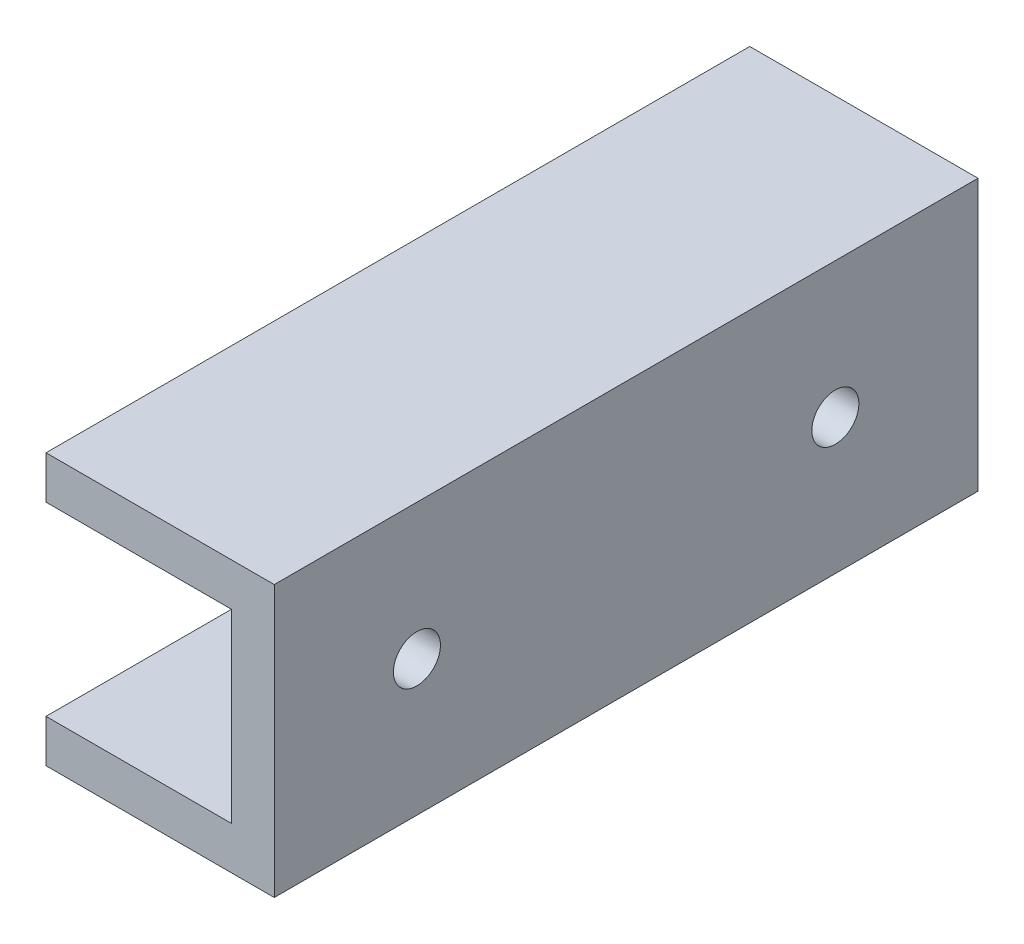
ISO-10303-21;
HEADER;
FILE_DESCRIPTION(('STEP AP214'),'2;1');
FILE_NAME('part.step','',(''),(''),'','','');
FILE_SCHEMA(('AUTOMOTIVE_DESIGN { 1 0 10303 214 1 1 1 1 }'));
ENDSEC;
DATA;
#1=APPLICATION_CONTEXT('core data for automotive mechanical design processes');
#2=APPLICATION_PROTOCOL_DEFINITION('international standard','automotive_design',2000,#1);
#3=PRODUCT_CONTEXT('',#1,'mechanical');
#4=PRODUCT('Part','Part','',(#3));
#5=PRODUCT_RELATED_PRODUCT_CATEGORY('part','',(#4));
#6=PRODUCT_DEFINITION_FORMATION('','',#4);
#7=PRODUCT_DEFINITION_CONTEXT('part definition',#1,'design');
#8=PRODUCT_DEFINITION('design','',#6,#7);
#9=PRODUCT_DEFINITION_SHAPE('','',#8);
#10=(LENGTH_UNIT() NAMED_UNIT(*) SI_UNIT(.MILLI.,.METRE.));
#11=(NAMED_UNIT(*) PLANE_ANGLE_UNIT() SI_UNIT($,.RADIAN.));
#12=(NAMED_UNIT(*) SI_UNIT($,.STERADIAN.) SOLID_ANGLE_UNIT());
#13=UNCERTAINTY_MEASURE_WITH_UNIT(LENGTH_MEASURE(1.E-05),#10,'distance_accuracy_value','');
#14=(GEOMETRIC_REPRESENTATION_CONTEXT(3) GLOBAL_UNCERTAINTY_ASSIGNED_CONTEXT((#13)) GLOBAL_UNIT_ASSIGNED_CONTEXT((#10,
#11,#12)) REPRESENTATION_CONTEXT('',''));
#15=CARTESIAN_POINT('',(0.,0.,0.));
#16=DIRECTION('',(0.,0.,1.));
#17=DIRECTION('',(1.,0.,0.));
#18=AXIS2_PLACEMENT_3D('',#15,#16,#17);
#19=CARTESIAN_POINT('',(0.,0.,49.33));
#20=DIRECTION('',(0.,0.,1.));
#21=DIRECTION('',(1.,0.,0.));
#22=AXIS2_PLACEMENT_3D('',#19,#20,#21);
#23=PLANE('',#22);
#24=DIRECTION('',(-1.,0.,0.));
#25=VECTOR('',#24,1.);
#26=CARTESIAN_POINT('',(0.,16.,49.33));
#27=LINE('',#26,#25);
#28=CARTESIAN_POINT('',(16.,16.,49.33));
#29=VERTEX_POINT('',#28);
#30=CARTESIAN_POINT('',(0.,16.,49.33));
#31=VERTEX_POINT('',#30);
#32=EDGE_CURVE('E138',#29,#31,#27,.T.);
#33=ORIENTED_EDGE('',*,*,#32,.T.);
#34=DIRECTION('',(0.,-1.,0.));
#35=VECTOR('',#34,1.);
#36=CARTESIAN_POINT('',(0.,0.,49.33));
#37=LINE('',#36,#35);
#38=CARTESIAN_POINT('',(0.,13.,49.33));
#39=VERTEX_POINT('',#38);
#40=EDGE_CURVE('E128',#31,#39,#37,.T.);
#41=ORIENTED_EDGE('',*,*,#40,.T.);
#42=DIRECTION('',(-1.,0.,0.));
#43=VECTOR('',#42,1.);
#44=CARTESIAN_POINT('',(0.,13.,49.33));
#45=LINE('',#44,#43);
#46=CARTESIAN_POINT('',(13.,13.,49.33));
#47=VERTEX_POINT('',#46);
#48=EDGE_CURVE('E131',#47,#39,#45,.T.);
#49=ORIENTED_EDGE('',*,*,#48,.F.);
#50=DIRECTION('',(0.,1.,0.));
#51=VECTOR('',#50,1.);
#52=CARTESIAN_POINT('',(13.,0.,49.33));
#53=LINE('',#52,#51);
#54=CARTESIAN_POINT('',(13.,0.,49.33));
#55=VERTEX_POINT('',#54);
#56=EDGE_CURVE('E143',#55,#47,#53,.T.);
#57=ORIENTED_EDGE('',*,*,#56,.F.);
#58=DIRECTION('',(1.,0.,0.));
#59=VECTOR('',#58,1.);
#60=CARTESIAN_POINT('',(0.,0.,49.33));
#61=LINE('',#60,#59);
#62=CARTESIAN_POINT('',(0.,0.,49.33));
#63=VERTEX_POINT('',#62);
#64=EDGE_CURVE('E145',#63,#55,#61,.T.);
#65=ORIENTED_EDGE('',*,*,#64,.F.);
#66=CARTESIAN_POINT('',(0.,-3.,49.33));
#67=VERTEX_POINT('',#66);
#68=EDGE_CURVE('E141',#63,#67,#37,.T.);
#69=ORIENTED_EDGE('',*,*,#68,.T.);
#70=DIRECTION('',(1.,0.,0.));
#71=VECTOR('',#70,1.);
#72=CARTESIAN_POINT('',(0.,-3.,49.33));
#73=LINE('',#72,#71);
#74=CARTESIAN_POINT('',(16.,-3.,49.33));
#75=VERTEX_POINT('',#74);
#76=EDGE_CURVE('E164',#67,#75,#73,.T.);
#77=ORIENTED_EDGE('',*,*,#76,.T.);
#78=DIRECTION('',(0.,1.,0.));
#79=VECTOR('',#78,1.);
#80=CARTESIAN_POINT('',(16.,0.,49.33));
#81=LINE('',#80,#79);
#82=EDGE_CURVE('E166',#75,#29,#81,.T.);
#83=ORIENTED_EDGE('',*,*,#82,.T.);
#84=EDGE_LOOP('',(#33,#41,#49,#57,#65,#69,#77,#83));
#85=FACE_BOUND('',#84,.T.);
#86=ADVANCED_FACE('F60',(#85),#23,.T.);
#87=CARTESIAN_POINT('',(0.,0.,0.));
#88=DIRECTION('',(0.,0.,1.));
#89=DIRECTION('',(1.,0.,0.));
#90=AXIS2_PLACEMENT_3D('',#87,#88,#89);
#91=PLANE('',#90);
#92=DIRECTION('',(0.,-1.,0.));
#93=VECTOR('',#92,1.);
#94=CARTESIAN_POINT('',(0.,0.,0.));
#95=LINE('',#94,#93);
#96=CARTESIAN_POINT('',(0.,16.,0.));
#97=VERTEX_POINT('',#96);
#98=CARTESIAN_POINT('',(0.,13.,0.));
#99=VERTEX_POINT('',#98);
#100=EDGE_CURVE('E85',#97,#99,#95,.T.);
#101=ORIENTED_EDGE('',*,*,#100,.F.);
#102=DIRECTION('',(-1.,0.,0.));
#103=VECTOR('',#102,1.);
#104=CARTESIAN_POINT('',(0.,16.,0.));
#105=LINE('',#104,#103);
#106=CARTESIAN_POINT('',(16.,16.,0.));
#107=VERTEX_POINT('',#106);
#108=EDGE_CURVE('E167',#107,#97,#105,.T.);
#109=ORIENTED_EDGE('',*,*,#108,.F.);
#110=DIRECTION('',(0.,1.,0.));
#111=VECTOR('',#110,1.);
#112=CARTESIAN_POINT('',(16.,0.,0.));
#113=LINE('',#112,#111);
#114=CARTESIAN_POINT('',(16.,-3.,0.));
#115=VERTEX_POINT('',#114);
#116=EDGE_CURVE('E171',#115,#107,#113,.T.);
#117=ORIENTED_EDGE('',*,*,#116,.F.);
#118=DIRECTION('',(1.,0.,0.));
#119=VECTOR('',#118,1.);
#120=CARTESIAN_POINT('',(0.,-3.,0.));
#121=LINE('',#120,#119);
#122=CARTESIAN_POINT('',(0.,-3.,0.));
#123=VERTEX_POINT('',#122);
#124=EDGE_CURVE('E163',#123,#115,#121,.T.);
#125=ORIENTED_EDGE('',*,*,#124,.F.);
#126=CARTESIAN_POINT('',(0.,0.,0.));
#127=VERTEX_POINT('',#126);
#128=EDGE_CURVE('E204',#127,#123,#95,.T.);
#129=ORIENTED_EDGE('',*,*,#128,.F.);
#130=DIRECTION('',(1.,0.,0.));
#131=VECTOR('',#130,1.);
#132=CARTESIAN_POINT('',(0.,0.,0.));
#133=LINE('',#132,#131);
#134=CARTESIAN_POINT('',(13.,0.,0.));
#135=VERTEX_POINT('',#134);
#136=EDGE_CURVE('E149',#127,#135,#133,.T.);
#137=ORIENTED_EDGE('',*,*,#136,.T.);
#138=DIRECTION('',(0.,1.,0.));
#139=VECTOR('',#138,1.);
#140=CARTESIAN_POINT('',(13.,0.,0.));
#141=LINE('',#140,#139);
#142=CARTESIAN_POINT('',(13.,13.,0.));
#143=VERTEX_POINT('',#142);
#144=EDGE_CURVE('E152',#135,#143,#141,.T.);
#145=ORIENTED_EDGE('',*,*,#144,.T.);
#146=DIRECTION('',(-1.,0.,0.));
#147=VECTOR('',#146,1.);
#148=CARTESIAN_POINT('',(0.,13.,0.));
#149=LINE('',#148,#147);
#150=EDGE_CURVE('E156',#143,#99,#149,.T.);
#151=ORIENTED_EDGE('',*,*,#150,.T.);
#152=EDGE_LOOP('',(#101,#109,#117,#125,#129,#137,#145,#151));
#153=FACE_BOUND('',#152,.T.);
#154=ADVANCED_FACE('F202',(#153),#91,.F.);
#155=CARTESIAN_POINT('',(0.,-3.,49.33));
#156=DIRECTION('',(0.,1.,0.));
#157=DIRECTION('',(0.,0.,1.));
#158=AXIS2_PLACEMENT_3D('',#155,#156,#157);
#159=PLANE('',#158);
#160=DIRECTION('',(0.,0.,1.));
#161=VECTOR('',#160,1.);
#162=CARTESIAN_POINT('',(0.,-3.,49.33));
#163=LINE('',#162,#161);
#164=EDGE_CURVE('E209',#123,#67,#163,.T.);
#165=ORIENTED_EDGE('',*,*,#164,.F.);
#166=ORIENTED_EDGE('',*,*,#124,.T.);
#167=DIRECTION('',(0.,0.,-1.));
#168=VECTOR('',#167,1.);
#169=CARTESIAN_POINT('',(16.,-3.,49.33));
#170=LINE('',#169,#168);
#171=EDGE_CURVE('E12',#75,#115,#170,.T.);
#172=ORIENTED_EDGE('',*,*,#171,.F.);
#173=ORIENTED_EDGE('',*,*,#76,.F.);
#174=EDGE_LOOP('',(#165,#166,#172,#173));
#175=FACE_BOUND('',#174,.T.);
#176=ADVANCED_FACE('F62',(#175),#159,.F.);
#177=CARTESIAN_POINT('',(0.,16.,49.33));
#178=DIRECTION('',(0.,-1.,0.));
#179=DIRECTION('',(0.,0.,-1.));
#180=AXIS2_PLACEMENT_3D('',#177,#178,#179);
#181=PLANE('',#180);
#182=DIRECTION('',(0.,0.,-1.));
#183=VECTOR('',#182,1.);
#184=CARTESIAN_POINT('',(0.,16.,49.33));
#185=LINE('',#184,#183);
#186=EDGE_CURVE('E187',#31,#97,#185,.T.);
#187=ORIENTED_EDGE('',*,*,#186,.F.);
#188=ORIENTED_EDGE('',*,*,#32,.F.);
#189=DIRECTION('',(0.,0.,-1.));
#190=VECTOR('',#189,1.);
#191=CARTESIAN_POINT('',(16.,16.,49.33));
#192=LINE('',#191,#190);
#193=EDGE_CURVE('E69',#29,#107,#192,.T.);
#194=ORIENTED_EDGE('',*,*,#193,.T.);
#195=ORIENTED_EDGE('',*,*,#108,.T.);
#196=EDGE_LOOP('',(#187,#188,#194,#195));
#197=FACE_BOUND('',#196,.T.);
#198=ADVANCED_FACE('F220',(#197),#181,.F.);
#199=CARTESIAN_POINT('',(16.,0.,49.33));
#200=DIRECTION('',(-1.,0.,0.));
#201=DIRECTION('',(0.,0.,1.));
#202=AXIS2_PLACEMENT_3D('',#199,#200,#201);
#203=PLANE('',#202);
#204=CARTESIAN_POINT('',(16.,6.5,10.));
#205=DIRECTION('',(-1.,0.,0.));
#206=DIRECTION('',(0.,0.,1.));
#207=AXIS2_PLACEMENT_3D('',#204,#205,#206);
#208=CIRCLE('',#207,1.65);
#209=CARTESIAN_POINT('',(16.,6.5,11.65));
#210=VERTEX_POINT('',#209);
#211=EDGE_CURVE('E153',#210,#210,#208,.T.);
#212=ORIENTED_EDGE('',*,*,#211,.T.);
#213=EDGE_LOOP('',(#212));
#214=FACE_BOUND('',#213,.T.);
#215=CARTESIAN_POINT('',(16.,6.5,39.33));
#216=DIRECTION('',(-1.,0.,0.));
#217=DIRECTION('',(0.,0.,1.));
#218=AXIS2_PLACEMENT_3D('',#215,#216,#217);
#219=CIRCLE('',#218,1.65);
#220=CARTESIAN_POINT('',(16.,6.5,40.98));
#221=VERTEX_POINT('',#220);
#222=EDGE_CURVE('E177',#221,#221,#219,.T.);
#223=ORIENTED_EDGE('',*,*,#222,.T.);
#224=EDGE_LOOP('',(#223));
#225=FACE_BOUND('',#224,.T.);
#226=ORIENTED_EDGE('',*,*,#116,.T.);
#227=ORIENTED_EDGE('',*,*,#193,.F.);
#228=ORIENTED_EDGE('',*,*,#82,.F.);
#229=ORIENTED_EDGE('',*,*,#171,.T.);
#230=EDGE_LOOP('',(#226,#227,#228,#229));
#231=FACE_BOUND('',#230,.T.);
#232=ADVANCED_FACE('F217',(#214,#225,#231),#203,.F.);
#233=CARTESIAN_POINT('',(0.,0.,49.33));
#234=DIRECTION('',(0.,1.,0.));
#235=DIRECTION('',(0.,0.,1.));
#236=AXIS2_PLACEMENT_3D('',#233,#234,#235);
#237=PLANE('',#236);
#238=ORIENTED_EDGE('',*,*,#136,.F.);
#239=DIRECTION('',(0.,0.,-1.));
#240=VECTOR('',#239,1.);
#241=CARTESIAN_POINT('',(0.,0.,49.33));
#242=LINE('',#241,#240);
#243=EDGE_CURVE('E161',#63,#127,#242,.T.);
#244=ORIENTED_EDGE('',*,*,#243,.F.);
#245=ORIENTED_EDGE('',*,*,#64,.T.);
#246=DIRECTION('',(0.,0.,-1.));
#247=VECTOR('',#246,1.);
#248=CARTESIAN_POINT('',(13.,0.,49.33));
#249=LINE('',#248,#247);
#250=EDGE_CURVE('E159',#55,#135,#249,.T.);
#251=ORIENTED_EDGE('',*,*,#250,.T.);
#252=EDGE_LOOP('',(#238,#244,#245,#251));
#253=FACE_BOUND('',#252,.T.);
#254=ADVANCED_FACE('F195',(#253),#237,.T.);
#255=CARTESIAN_POINT('',(13.,0.,49.33));
#256=DIRECTION('',(-1.,0.,0.));
#257=DIRECTION('',(0.,0.,1.));
#258=AXIS2_PLACEMENT_3D('',#255,#256,#257);
#259=PLANE('',#258);
#260=CARTESIAN_POINT('',(13.,6.5,10.));
#261=DIRECTION('',(-1.,0.,0.));
#262=DIRECTION('',(0.,0.,1.));
#263=AXIS2_PLACEMENT_3D('',#260,#261,#262);
#264=CIRCLE('',#263,1.65);
#265=CARTESIAN_POINT('',(13.,6.5,11.65));
#266=VERTEX_POINT('',#265);
#267=EDGE_CURVE('E64',#266,#266,#264,.T.);
#268=ORIENTED_EDGE('',*,*,#267,.F.);
#269=EDGE_LOOP('',(#268));
#270=FACE_BOUND('',#269,.T.);
#271=CARTESIAN_POINT('',(13.,6.5,39.33));
#272=DIRECTION('',(-1.,0.,0.));
#273=DIRECTION('',(0.,0.,1.));
#274=AXIS2_PLACEMENT_3D('',#271,#272,#273);
#275=CIRCLE('',#274,1.65);
#276=CARTESIAN_POINT('',(13.,6.5,40.98));
#277=VERTEX_POINT('',#276);
#278=EDGE_CURVE('E139',#277,#277,#275,.T.);
#279=ORIENTED_EDGE('',*,*,#278,.F.);
#280=EDGE_LOOP('',(#279));
#281=FACE_BOUND('',#280,.T.);
#282=ORIENTED_EDGE('',*,*,#144,.F.);
#283=ORIENTED_EDGE('',*,*,#250,.F.);
#284=ORIENTED_EDGE('',*,*,#56,.T.);
#285=DIRECTION('',(0.,0.,-1.));
#286=VECTOR('',#285,1.);
#287=CARTESIAN_POINT('',(13.,13.,49.33));
#288=LINE('',#287,#286);
#289=EDGE_CURVE('E77',#47,#143,#288,.T.);
#290=ORIENTED_EDGE('',*,*,#289,.T.);
#291=EDGE_LOOP('',(#282,#283,#284,#290));
#292=FACE_BOUND('',#291,.T.);
#293=ADVANCED_FACE('F199',(#270,#281,#292),#259,.T.);
#294=CARTESIAN_POINT('',(0.,13.,49.33));
#295=DIRECTION('',(0.,-1.,0.));
#296=DIRECTION('',(0.,0.,-1.));
#297=AXIS2_PLACEMENT_3D('',#294,#295,#296);
#298=PLANE('',#297);
#299=ORIENTED_EDGE('',*,*,#150,.F.);
#300=ORIENTED_EDGE('',*,*,#289,.F.);
#301=ORIENTED_EDGE('',*,*,#48,.T.);
#302=DIRECTION('',(0.,0.,-1.));
#303=VECTOR('',#302,1.);
#304=CARTESIAN_POINT('',(0.,13.,49.33));
#305=LINE('',#304,#303);
#306=EDGE_CURVE('E125',#39,#99,#305,.T.);
#307=ORIENTED_EDGE('',*,*,#306,.T.);
#308=EDGE_LOOP('',(#299,#300,#301,#307));
#309=FACE_BOUND('',#308,.T.);
#310=ADVANCED_FACE('F142',(#309),#298,.T.);
#311=CARTESIAN_POINT('',(27.,6.5,39.33));
#312=DIRECTION('',(-1.,0.,0.));
#313=DIRECTION('',(0.,0.,1.));
#314=AXIS2_PLACEMENT_3D('',#311,#312,#313);
#315=CYLINDRICAL_SURFACE('',#314,1.65);
#316=CARTESIAN_POINT('',(13.,6.5,40.98));
#317=CARTESIAN_POINT('',(13.03125,6.5,40.98));
#318=CARTESIAN_POINT('',(13.0625,6.5,40.98));
#319=CARTESIAN_POINT('',(13.125,6.5,40.98));
#320=CARTESIAN_POINT('',(13.15625,6.5,40.98));
#321=CARTESIAN_POINT('',(13.21875,6.5,40.98));
#322=CARTESIAN_POINT('',(13.25,6.5,40.98));
#323=CARTESIAN_POINT('',(13.3125,6.5,40.98));
#324=CARTESIAN_POINT('',(13.34375,6.5,40.98));
#325=CARTESIAN_POINT('',(13.40625,6.5,40.98));
#326=CARTESIAN_POINT('',(13.4375,6.5,40.98));
#327=CARTESIAN_POINT('',(13.5,6.5,40.98));
#328=CARTESIAN_POINT('',(13.53125,6.5,40.98));
#329=CARTESIAN_POINT('',(13.59375,6.5,40.98));
#330=CARTESIAN_POINT('',(13.625,6.5,40.98));
#331=CARTESIAN_POINT('',(13.6875,6.5,40.98));
#332=CARTESIAN_POINT('',(13.71875,6.5,40.98));
#333=CARTESIAN_POINT('',(13.78125,6.5,40.98));
#334=CARTESIAN_POINT('',(13.8125,6.5,40.98));
#335=CARTESIAN_POINT('',(13.875,6.5,40.98));
#336=CARTESIAN_POINT('',(13.90625,6.5,40.98));
#337=CARTESIAN_POINT('',(13.96875,6.5,40.98));
#338=CARTESIAN_POINT('',(14.,6.5,40.98));
#339=CARTESIAN_POINT('',(14.0625,6.5,40.98));
#340=CARTESIAN_POINT('',(14.09375,6.5,40.98));
#341=CARTESIAN_POINT('',(14.15625,6.5,40.98));
#342=CARTESIAN_POINT('',(14.1875,6.5,40.98));
#343=CARTESIAN_POINT('',(14.25,6.5,40.98));
#344=CARTESIAN_POINT('',(14.28125,6.5,40.98));
#345=CARTESIAN_POINT('',(14.34375,6.5,40.98));
#346=CARTESIAN_POINT('',(14.375,6.5,40.98));
#347=CARTESIAN_POINT('',(14.4375,6.5,40.98));
#348=CARTESIAN_POINT('',(14.46875,6.5,40.98));
#349=CARTESIAN_POINT('',(14.53125,6.5,40.98));
#350=CARTESIAN_POINT('',(14.5625,6.5,40.98));
#351=CARTESIAN_POINT('',(14.625,6.5,40.98));
#352=CARTESIAN_POINT('',(14.65625,6.5,40.98));
#353=CARTESIAN_POINT('',(14.71875,6.5,40.98));
#354=CARTESIAN_POINT('',(14.75,6.5,40.98));
#355=CARTESIAN_POINT('',(14.8125,6.5,40.98));
#356=CARTESIAN_POINT('',(14.84375,6.5,40.98));
#357=CARTESIAN_POINT('',(14.90625,6.5,40.98));
#358=CARTESIAN_POINT('',(14.9375,6.5,40.98));
#359=CARTESIAN_POINT('',(15.,6.5,40.98));
#360=CARTESIAN_POINT('',(15.03125,6.5,40.98));
#361=CARTESIAN_POINT('',(15.09375,6.5,40.98));
#362=CARTESIAN_POINT('',(15.125,6.5,40.98));
#363=CARTESIAN_POINT('',(15.1875,6.5,40.98));
#364=CARTESIAN_POINT('',(15.21875,6.5,40.98));
#365=CARTESIAN_POINT('',(15.28125,6.5,40.98));
#366=CARTESIAN_POINT('',(15.3125,6.5,40.98));
#367=CARTESIAN_POINT('',(15.375,6.5,40.98));
#368=CARTESIAN_POINT('',(15.40625,6.5,40.98));
#369=CARTESIAN_POINT('',(15.46875,6.5,40.98));
#370=CARTESIAN_POINT('',(15.5,6.5,40.98));
#371=CARTESIAN_POINT('',(15.5625,6.5,40.98));
#372=CARTESIAN_POINT('',(15.59375,6.5,40.98));
#373=CARTESIAN_POINT('',(15.65625,6.5,40.98));
#374=CARTESIAN_POINT('',(15.6875,6.5,40.98));
#375=CARTESIAN_POINT('',(15.75,6.5,40.98));
#376=CARTESIAN_POINT('',(15.78125,6.5,40.98));
#377=CARTESIAN_POINT('',(15.84375,6.5,40.98));
#378=CARTESIAN_POINT('',(15.875,6.5,40.98));
#379=CARTESIAN_POINT('',(15.9375,6.5,40.98));
#380=CARTESIAN_POINT('',(15.96875,6.5,40.98));
#381=CARTESIAN_POINT('',(16.,6.5,40.98));
#382=B_SPLINE_CURVE_WITH_KNOTS('',3,(#316,#317,#318,#319,#320,#321,#322,#323,#324,#325,#326,
#327,#328,#329,#330,#331,#332,#333,#334,#335,#336,#337,#338,#339,#340,#341,#342,#343,#344,#345,
#346,#347,#348,#349,#350,#351,#352,#353,#354,#355,#356,#357,#358,#359,#360,#361,#362,#363,#364,
#365,#366,#367,#368,#369,#370,#371,#372,#373,#374,#375,#376,#377,#378,#379,#380,#381),
.UNSPECIFIED.,.F.,.F.,(4,2,2,2,2,2,2,2,2,2,2,2,2,2,2,2,2,2,2,2,2,2,2,2,2,2,2,2,2,2,2,2,4),(0.,
0.0937500000000001,0.1875,0.28125,0.375,0.46875,0.5625,0.656250000000001,0.750000000000001,
0.843749999999999,0.937499999999999,1.03125,1.125,1.21875,1.3125,1.40625,1.5,1.59375,1.6875,
1.78125,1.875,1.96875,2.0625,2.15625,2.25,2.34375,2.4375,2.53125,2.625,2.71875,2.8125,2.90625,
3.),.UNSPECIFIED.);
#383=EDGE_CURVE('BSEAM242',#277,#221,#382,.T.);
#384=ORIENTED_EDGE('',*,*,#278,.T.);
#385=ORIENTED_EDGE('',*,*,#222,.F.);
#386=ORIENTED_EDGE('',*,*,#383,.T.);
#387=ORIENTED_EDGE('',*,*,#383,.F.);
#388=EDGE_LOOP('',(#384,#386,#385,#387));
#389=FACE_BOUND('',#388,.T.);
#390=ADVANCED_FACE('F242',(#389),#315,.F.);
#391=CARTESIAN_POINT('',(27.,6.5,10.));
#392=DIRECTION('',(-1.,0.,0.));
#393=DIRECTION('',(0.,0.,1.));
#394=AXIS2_PLACEMENT_3D('',#391,#392,#393);
#395=CYLINDRICAL_SURFACE('',#394,1.65);
#396=CARTESIAN_POINT('',(13.,6.5,11.65));
#397=CARTESIAN_POINT('',(13.03125,6.5,11.65));
#398=CARTESIAN_POINT('',(13.0625,6.5,11.65));
#399=CARTESIAN_POINT('',(13.125,6.5,11.65));
#400=CARTESIAN_POINT('',(13.15625,6.5,11.65));
#401=CARTESIAN_POINT('',(13.21875,6.5,11.65));
#402=CARTESIAN_POINT('',(13.25,6.5,11.65));
#403=CARTESIAN_POINT('',(13.3125,6.5,11.65));
#404=CARTESIAN_POINT('',(13.34375,6.5,11.65));
#405=CARTESIAN_POINT('',(13.40625,6.5,11.65));
#406=CARTESIAN_POINT('',(13.4375,6.5,11.65));
#407=CARTESIAN_POINT('',(13.5,6.5,11.65));
#408=CARTESIAN_POINT('',(13.53125,6.5,11.65));
#409=CARTESIAN_POINT('',(13.59375,6.5,11.65));
#410=CARTESIAN_POINT('',(13.625,6.5,11.65));
#411=CARTESIAN_POINT('',(13.6875,6.5,11.65));
#412=CARTESIAN_POINT('',(13.71875,6.5,11.65));
#413=CARTESIAN_POINT('',(13.78125,6.5,11.65));
#414=CARTESIAN_POINT('',(13.8125,6.5,11.65));
#415=CARTESIAN_POINT('',(13.875,6.5,11.65));
#416=CARTESIAN_POINT('',(13.90625,6.5,11.65));
#417=CARTESIAN_POINT('',(13.96875,6.5,11.65));
#418=CARTESIAN_POINT('',(14.,6.5,11.65));
#419=CARTESIAN_POINT('',(14.0625,6.5,11.65));
#420=CARTESIAN_POINT('',(14.09375,6.5,11.65));
#421=CARTESIAN_POINT('',(14.15625,6.5,11.65));
#422=CARTESIAN_POINT('',(14.1875,6.5,11.65));
#423=CARTESIAN_POINT('',(14.25,6.5,11.65));
#424=CARTESIAN_POINT('',(14.28125,6.5,11.65));
#425=CARTESIAN_POINT('',(14.34375,6.5,11.65));
#426=CARTESIAN_POINT('',(14.375,6.5,11.65));
#427=CARTESIAN_POINT('',(14.4375,6.5,11.65));
#428=CARTESIAN_POINT('',(14.46875,6.5,11.65));
#429=CARTESIAN_POINT('',(14.53125,6.5,11.65));
#430=CARTESIAN_POINT('',(14.5625,6.5,11.65));
#431=CARTESIAN_POINT('',(14.625,6.5,11.65));
#432=CARTESIAN_POINT('',(14.65625,6.5,11.65));
#433=CARTESIAN_POINT('',(14.71875,6.5,11.65));
#434=CARTESIAN_POINT('',(14.75,6.5,11.65));
#435=CARTESIAN_POINT('',(14.8125,6.5,11.65));
#436=CARTESIAN_POINT('',(14.84375,6.5,11.65));
#437=CARTESIAN_POINT('',(14.90625,6.5,11.65));
#438=CARTESIAN_POINT('',(14.9375,6.5,11.65));
#439=CARTESIAN_POINT('',(15.,6.5,11.65));
#440=CARTESIAN_POINT('',(15.03125,6.5,11.65));
#441=CARTESIAN_POINT('',(15.09375,6.5,11.65));
#442=CARTESIAN_POINT('',(15.125,6.5,11.65));
#443=CARTESIAN_POINT('',(15.1875,6.5,11.65));
#444=CARTESIAN_POINT('',(15.21875,6.5,11.65));
#445=CARTESIAN_POINT('',(15.28125,6.5,11.65));
#446=CARTESIAN_POINT('',(15.3125,6.5,11.65));
#447=CARTESIAN_POINT('',(15.375,6.5,11.65));
#448=CARTESIAN_POINT('',(15.40625,6.5,11.65));
#449=CARTESIAN_POINT('',(15.46875,6.5,11.65));
#450=CARTESIAN_POINT('',(15.5,6.5,11.65));
#451=CARTESIAN_POINT('',(15.5625,6.5,11.65));
#452=CARTESIAN_POINT('',(15.59375,6.5,11.65));
#453=CARTESIAN_POINT('',(15.65625,6.5,11.65));
#454=CARTESIAN_POINT('',(15.6875,6.5,11.65));
#455=CARTESIAN_POINT('',(15.75,6.5,11.65));
#456=CARTESIAN_POINT('',(15.78125,6.5,11.65));
#457=CARTESIAN_POINT('',(15.84375,6.5,11.65));
#458=CARTESIAN_POINT('',(15.875,6.5,11.65));
#459=CARTESIAN_POINT('',(15.9375,6.5,11.65));
#460=CARTESIAN_POINT('',(15.96875,6.5,11.65));
#461=CARTESIAN_POINT('',(16.,6.5,11.65));
#462=B_SPLINE_CURVE_WITH_KNOTS('',3,(#396,#397,#398,#399,#400,#401,#402,#403,#404,#405,#406,
#407,#408,#409,#410,#411,#412,#413,#414,#415,#416,#417,#418,#419,#420,#421,#422,#423,#424,#425,
#426,#427,#428,#429,#430,#431,#432,#433,#434,#435,#436,#437,#438,#439,#440,#441,#442,#443,#444,
#445,#446,#447,#448,#449,#450,#451,#452,#453,#454,#455,#456,#457,#458,#459,#460,#461),
.UNSPECIFIED.,.F.,.F.,(4,2,2,2,2,2,2,2,2,2,2,2,2,2,2,2,2,2,2,2,2,2,2,2,2,2,2,2,2,2,2,2,4),(0.,
0.0937500000000001,0.1875,0.28125,0.375,0.46875,0.5625,0.656250000000001,0.750000000000001,
0.843749999999999,0.937499999999999,1.03125,1.125,1.21875,1.3125,1.40625,1.5,1.59375,1.6875,
1.78125,1.875,1.96875,2.0625,2.15625,2.25,2.34375,2.4375,2.53125,2.625,2.71875,2.8125,2.90625,
3.),.UNSPECIFIED.);
#463=EDGE_CURVE('BSEAM245',#266,#210,#462,.T.);
#464=ORIENTED_EDGE('',*,*,#267,.T.);
#465=ORIENTED_EDGE('',*,*,#211,.F.);
#466=ORIENTED_EDGE('',*,*,#463,.T.);
#467=ORIENTED_EDGE('',*,*,#463,.F.);
#468=EDGE_LOOP('',(#464,#466,#465,#467));
#469=FACE_BOUND('',#468,.T.);
#470=ADVANCED_FACE('F245',(#469),#395,.F.);
#471=CARTESIAN_POINT('',(0.,0.,0.));
#472=DIRECTION('',(-1.,0.,0.));
#473=DIRECTION('',(0.,0.,1.));
#474=AXIS2_PLACEMENT_3D('',#471,#472,#473);
#475=PLANE('',#474);
#476=ORIENTED_EDGE('',*,*,#186,.T.);
#477=ORIENTED_EDGE('',*,*,#100,.T.);
#478=ORIENTED_EDGE('',*,*,#306,.F.);
#479=ORIENTED_EDGE('',*,*,#40,.F.);
#480=EDGE_LOOP('',(#476,#477,#478,#479));
#481=FACE_BOUND('',#480,.T.);
#482=ADVANCED_FACE('F127',(#481),#475,.T.);
#483=ORIENTED_EDGE('',*,*,#164,.T.);
#484=ORIENTED_EDGE('',*,*,#68,.F.);
#485=ORIENTED_EDGE('',*,*,#243,.T.);
#486=ORIENTED_EDGE('',*,*,#128,.T.);
#487=EDGE_LOOP('',(#483,#484,#485,#486));
#488=FACE_BOUND('',#487,.T.);
#489=ADVANCED_FACE('F210',(#488),#475,.T.);
#490=CLOSED_SHELL('',(#86,#154,#176,#198,#232,#254,#293,#310,#390,#470,#482,#489));
#491=MANIFOLD_SOLID_BREP('B2',#490);
#492=ADVANCED_BREP_SHAPE_REPRESENTATION('',(#18,#491),#14);
#493=SHAPE_DEFINITION_REPRESENTATION(#9,#492);
ENDSEC;
END-ISO-10303-21;
